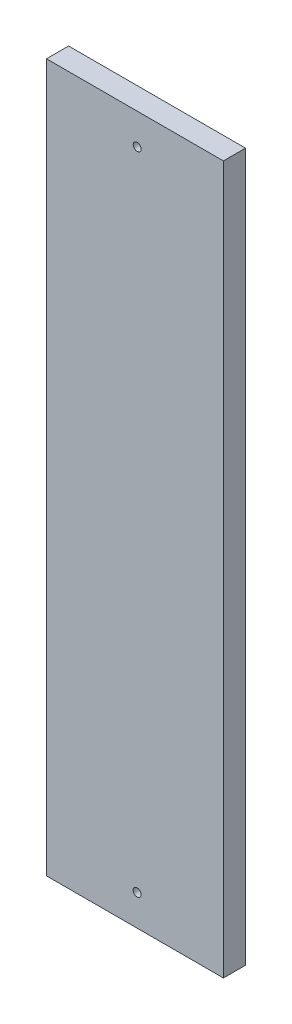
ISO-10303-21;
HEADER;
FILE_DESCRIPTION(('STEP AP214'),'2;1');
FILE_NAME('part.step','',(''),(''),'','','');
FILE_SCHEMA(('AUTOMOTIVE_DESIGN { 1 0 10303 214 1 1 1 1 }'));
ENDSEC;
DATA;
#1=APPLICATION_CONTEXT('core data for automotive mechanical design processes');
#2=APPLICATION_PROTOCOL_DEFINITION('international standard','automotive_design',2000,#1);
#3=PRODUCT_CONTEXT('',#1,'mechanical');
#4=PRODUCT('Part','Part','',(#3));
#5=PRODUCT_RELATED_PRODUCT_CATEGORY('part','',(#4));
#6=PRODUCT_DEFINITION_FORMATION('','',#4);
#7=PRODUCT_DEFINITION_CONTEXT('part definition',#1,'design');
#8=PRODUCT_DEFINITION('design','',#6,#7);
#9=PRODUCT_DEFINITION_SHAPE('','',#8);
#10=(LENGTH_UNIT() NAMED_UNIT(*) SI_UNIT(.MILLI.,.METRE.));
#11=(NAMED_UNIT(*) PLANE_ANGLE_UNIT() SI_UNIT($,.RADIAN.));
#12=(NAMED_UNIT(*) SI_UNIT($,.STERADIAN.) SOLID_ANGLE_UNIT());
#13=UNCERTAINTY_MEASURE_WITH_UNIT(LENGTH_MEASURE(1.E-05),#10,'distance_accuracy_value','');
#14=(GEOMETRIC_REPRESENTATION_CONTEXT(3) GLOBAL_UNCERTAINTY_ASSIGNED_CONTEXT((#13)) GLOBAL_UNIT_ASSIGNED_CONTEXT((#10,
#11,#12)) REPRESENTATION_CONTEXT('',''));
#15=CARTESIAN_POINT('',(0.,0.,0.));
#16=DIRECTION('',(0.,0.,1.));
#17=DIRECTION('',(1.,0.,0.));
#18=AXIS2_PLACEMENT_3D('',#15,#16,#17);
#19=CARTESIAN_POINT('',(25.4,203.2,3.175));
#20=DIRECTION('',(-1.,0.,0.));
#21=DIRECTION('',(0.,0.,1.));
#22=AXIS2_PLACEMENT_3D('',#19,#20,#21);
#23=PLANE('',#22);
#24=DIRECTION('',(0.,0.,-1.));
#25=VECTOR('',#24,1.);
#26=CARTESIAN_POINT('',(25.4,0.,3.175));
#27=LINE('',#26,#25);
#28=CARTESIAN_POINT('',(25.4,0.,3.175));
#29=VERTEX_POINT('',#28);
#30=CARTESIAN_POINT('',(25.4,0.,-3.175));
#31=VERTEX_POINT('',#30);
#32=EDGE_CURVE('E96',#29,#31,#27,.T.);
#33=ORIENTED_EDGE('',*,*,#32,.T.);
#34=DIRECTION('',(0.,-1.,0.));
#35=VECTOR('',#34,1.);
#36=CARTESIAN_POINT('',(25.4,203.2,-3.175));
#37=LINE('',#36,#35);
#38=CARTESIAN_POINT('',(25.4,203.2,-3.175));
#39=VERTEX_POINT('',#38);
#40=EDGE_CURVE('E11',#39,#31,#37,.T.);
#41=ORIENTED_EDGE('',*,*,#40,.F.);
#42=DIRECTION('',(0.,0.,-1.));
#43=VECTOR('',#42,1.);
#44=CARTESIAN_POINT('',(25.4,203.2,3.175));
#45=LINE('',#44,#43);
#46=CARTESIAN_POINT('',(25.4,203.2,3.175));
#47=VERTEX_POINT('',#46);
#48=EDGE_CURVE('E84',#47,#39,#45,.T.);
#49=ORIENTED_EDGE('',*,*,#48,.F.);
#50=DIRECTION('',(0.,-1.,0.));
#51=VECTOR('',#50,1.);
#52=CARTESIAN_POINT('',(25.4,203.2,3.175));
#53=LINE('',#52,#51);
#54=EDGE_CURVE('E92',#47,#29,#53,.T.);
#55=ORIENTED_EDGE('',*,*,#54,.T.);
#56=EDGE_LOOP('',(#33,#41,#49,#55));
#57=FACE_BOUND('',#56,.T.);
#58=ADVANCED_FACE('F33',(#57),#23,.F.);
#59=CARTESIAN_POINT('',(-25.4,203.2,-3.175));
#60=DIRECTION('',(0.,0.,1.));
#61=DIRECTION('',(1.,0.,0.));
#62=AXIS2_PLACEMENT_3D('',#59,#60,#61);
#63=PLANE('',#62);
#64=CARTESIAN_POINT('',(0.635000000000016,8.89000000000006,-3.175));
#65=DIRECTION('',(0.,0.,1.));
#66=DIRECTION('',(-1.,0.,0.));
#67=AXIS2_PLACEMENT_3D('',#64,#65,#66);
#68=CIRCLE('',#67,1.1303);
#69=CARTESIAN_POINT('',(-0.49529999999998,8.89000000000006,-3.175));
#70=VERTEX_POINT('',#69);
#71=EDGE_CURVE('E113',#70,#70,#68,.T.);
#72=ORIENTED_EDGE('',*,*,#71,.T.);
#73=EDGE_LOOP('',(#72));
#74=FACE_BOUND('',#73,.T.);
#75=CARTESIAN_POINT('',(0.634999999999993,194.31,-3.175));
#76=DIRECTION('',(0.,0.,1.));
#77=DIRECTION('',(1.,0.,0.));
#78=AXIS2_PLACEMENT_3D('',#75,#76,#77);
#79=CIRCLE('',#78,1.1303);
#80=CARTESIAN_POINT('',(1.76529999999999,194.31,-3.175));
#81=VERTEX_POINT('',#80);
#82=EDGE_CURVE('E99',#81,#81,#79,.T.);
#83=ORIENTED_EDGE('',*,*,#82,.T.);
#84=EDGE_LOOP('',(#83));
#85=FACE_BOUND('',#84,.T.);
#86=DIRECTION('',(-1.,0.,0.));
#87=VECTOR('',#86,1.);
#88=CARTESIAN_POINT('',(-25.4,0.,-3.175));
#89=LINE('',#88,#87);
#90=CARTESIAN_POINT('',(-25.4,0.,-3.175));
#91=VERTEX_POINT('',#90);
#92=EDGE_CURVE('E88',#31,#91,#89,.T.);
#93=ORIENTED_EDGE('',*,*,#92,.T.);
#94=DIRECTION('',(0.,-1.,0.));
#95=VECTOR('',#94,1.);
#96=CARTESIAN_POINT('',(-25.4,203.2,-3.175));
#97=LINE('',#96,#95);
#98=CARTESIAN_POINT('',(-25.4,203.2,-3.175));
#99=VERTEX_POINT('',#98);
#100=EDGE_CURVE('E41',#99,#91,#97,.T.);
#101=ORIENTED_EDGE('',*,*,#100,.F.);
#102=DIRECTION('',(-1.,0.,0.));
#103=VECTOR('',#102,1.);
#104=CARTESIAN_POINT('',(-25.4,203.2,-3.175));
#105=LINE('',#104,#103);
#106=EDGE_CURVE('E79',#39,#99,#105,.T.);
#107=ORIENTED_EDGE('',*,*,#106,.F.);
#108=ORIENTED_EDGE('',*,*,#40,.T.);
#109=EDGE_LOOP('',(#93,#101,#107,#108));
#110=FACE_BOUND('',#109,.T.);
#111=ADVANCED_FACE('F87',(#74,#85,#110),#63,.F.);
#112=CARTESIAN_POINT('',(-25.4,203.2,3.175));
#113=DIRECTION('',(1.,0.,0.));
#114=DIRECTION('',(0.,0.,-1.));
#115=AXIS2_PLACEMENT_3D('',#112,#113,#114);
#116=PLANE('',#115);
#117=DIRECTION('',(0.,0.,1.));
#118=VECTOR('',#117,1.);
#119=CARTESIAN_POINT('',(-25.4,0.,3.175));
#120=LINE('',#119,#118);
#121=CARTESIAN_POINT('',(-25.4,0.,3.175));
#122=VERTEX_POINT('',#121);
#123=EDGE_CURVE('E66',#91,#122,#120,.T.);
#124=ORIENTED_EDGE('',*,*,#123,.T.);
#125=DIRECTION('',(0.,-1.,0.));
#126=VECTOR('',#125,1.);
#127=CARTESIAN_POINT('',(-25.4,203.2,3.175));
#128=LINE('',#127,#126);
#129=CARTESIAN_POINT('',(-25.4,203.2,3.175));
#130=VERTEX_POINT('',#129);
#131=EDGE_CURVE('E89',#130,#122,#128,.T.);
#132=ORIENTED_EDGE('',*,*,#131,.F.);
#133=DIRECTION('',(0.,0.,1.));
#134=VECTOR('',#133,1.);
#135=CARTESIAN_POINT('',(-25.4,203.2,3.175));
#136=LINE('',#135,#134);
#137=EDGE_CURVE('E82',#99,#130,#136,.T.);
#138=ORIENTED_EDGE('',*,*,#137,.F.);
#139=ORIENTED_EDGE('',*,*,#100,.T.);
#140=EDGE_LOOP('',(#124,#132,#138,#139));
#141=FACE_BOUND('',#140,.T.);
#142=ADVANCED_FACE('F90',(#141),#116,.F.);
#143=CARTESIAN_POINT('',(-25.4,203.2,3.175));
#144=DIRECTION('',(0.,0.,-1.));
#145=DIRECTION('',(-1.,0.,0.));
#146=AXIS2_PLACEMENT_3D('',#143,#144,#145);
#147=PLANE('',#146);
#148=CARTESIAN_POINT('',(0.635000000000016,8.89000000000006,3.175));
#149=DIRECTION('',(0.,0.,1.));
#150=DIRECTION('',(-1.,0.,0.));
#151=AXIS2_PLACEMENT_3D('',#148,#149,#150);
#152=CIRCLE('',#151,1.1303);
#153=CARTESIAN_POINT('',(-0.49529999999998,8.89000000000006,3.175));
#154=VERTEX_POINT('',#153);
#155=EDGE_CURVE('E116',#154,#154,#152,.T.);
#156=ORIENTED_EDGE('',*,*,#155,.F.);
#157=EDGE_LOOP('',(#156));
#158=FACE_BOUND('',#157,.T.);
#159=CARTESIAN_POINT('',(0.634999999999993,194.31,3.175));
#160=DIRECTION('',(0.,0.,1.));
#161=DIRECTION('',(1.,0.,0.));
#162=AXIS2_PLACEMENT_3D('',#159,#160,#161);
#163=CIRCLE('',#162,1.1303);
#164=CARTESIAN_POINT('',(1.76529999999999,194.31,3.175));
#165=VERTEX_POINT('',#164);
#166=EDGE_CURVE('E110',#165,#165,#163,.T.);
#167=ORIENTED_EDGE('',*,*,#166,.F.);
#168=EDGE_LOOP('',(#167));
#169=FACE_BOUND('',#168,.T.);
#170=DIRECTION('',(1.,0.,0.));
#171=VECTOR('',#170,1.);
#172=CARTESIAN_POINT('',(-25.4,0.,3.175));
#173=LINE('',#172,#171);
#174=EDGE_CURVE('E72',#122,#29,#173,.T.);
#175=ORIENTED_EDGE('',*,*,#174,.T.);
#176=ORIENTED_EDGE('',*,*,#54,.F.);
#177=DIRECTION('',(1.,0.,0.));
#178=VECTOR('',#177,1.);
#179=CARTESIAN_POINT('',(-25.4,203.2,3.175));
#180=LINE('',#179,#178);
#181=EDGE_CURVE('E49',#130,#47,#180,.T.);
#182=ORIENTED_EDGE('',*,*,#181,.F.);
#183=ORIENTED_EDGE('',*,*,#131,.T.);
#184=EDGE_LOOP('',(#175,#176,#182,#183));
#185=FACE_BOUND('',#184,.T.);
#186=ADVANCED_FACE('F104',(#158,#169,#185),#147,.F.);
#187=CARTESIAN_POINT('',(0.,203.2,0.));
#188=DIRECTION('',(0.,-1.,0.));
#189=DIRECTION('',(0.,0.,-1.));
#190=AXIS2_PLACEMENT_3D('',#187,#188,#189);
#191=PLANE('',#190);
#192=ORIENTED_EDGE('',*,*,#48,.T.);
#193=ORIENTED_EDGE('',*,*,#106,.T.);
#194=ORIENTED_EDGE('',*,*,#137,.T.);
#195=ORIENTED_EDGE('',*,*,#181,.T.);
#196=EDGE_LOOP('',(#192,#193,#194,#195));
#197=FACE_BOUND('',#196,.T.);
#198=ADVANCED_FACE('F80',(#197),#191,.F.);
#199=CARTESIAN_POINT('',(0.,0.,0.));
#200=DIRECTION('',(0.,-1.,0.));
#201=DIRECTION('',(0.,0.,-1.));
#202=AXIS2_PLACEMENT_3D('',#199,#200,#201);
#203=PLANE('',#202);
#204=ORIENTED_EDGE('',*,*,#32,.F.);
#205=ORIENTED_EDGE('',*,*,#174,.F.);
#206=ORIENTED_EDGE('',*,*,#123,.F.);
#207=ORIENTED_EDGE('',*,*,#92,.F.);
#208=EDGE_LOOP('',(#204,#205,#206,#207));
#209=FACE_BOUND('',#208,.T.);
#210=ADVANCED_FACE('F107',(#209),#203,.T.);
#211=CARTESIAN_POINT('',(0.634999999999993,194.31,-3.175));
#212=DIRECTION('',(0.,0.,1.));
#213=DIRECTION('',(1.,0.,0.));
#214=AXIS2_PLACEMENT_3D('',#211,#212,#213);
#215=CYLINDRICAL_SURFACE('',#214,1.1303);
#216=ORIENTED_EDGE('',*,*,#82,.F.);
#217=EDGE_LOOP('',(#216));
#218=FACE_BOUND('',#217,.T.);
#219=ORIENTED_EDGE('',*,*,#166,.T.);
#220=EDGE_LOOP('',(#219));
#221=FACE_BOUND('',#220,.T.);
#222=ADVANCED_FACE('F127',(#218,#221),#215,.F.);
#223=CARTESIAN_POINT('',(0.635000000000016,8.89000000000006,-3.175));
#224=DIRECTION('',(0.,0.,1.));
#225=DIRECTION('',(1.,0.,0.));
#226=AXIS2_PLACEMENT_3D('',#223,#224,#225);
#227=CYLINDRICAL_SURFACE('',#226,1.1303);
#228=ORIENTED_EDGE('',*,*,#71,.F.);
#229=EDGE_LOOP('',(#228));
#230=FACE_BOUND('',#229,.T.);
#231=ORIENTED_EDGE('',*,*,#155,.T.);
#232=EDGE_LOOP('',(#231));
#233=FACE_BOUND('',#232,.T.);
#234=ADVANCED_FACE('F124',(#230,#233),#227,.F.);
#235=CLOSED_SHELL('',(#58,#111,#142,#186,#198,#210,#222,#234));
#236=MANIFOLD_SOLID_BREP('B2',#235);
#237=ADVANCED_BREP_SHAPE_REPRESENTATION('',(#18,#236),#14);
#238=SHAPE_DEFINITION_REPRESENTATION(#9,#237);
ENDSEC;
END-ISO-10303-21;
